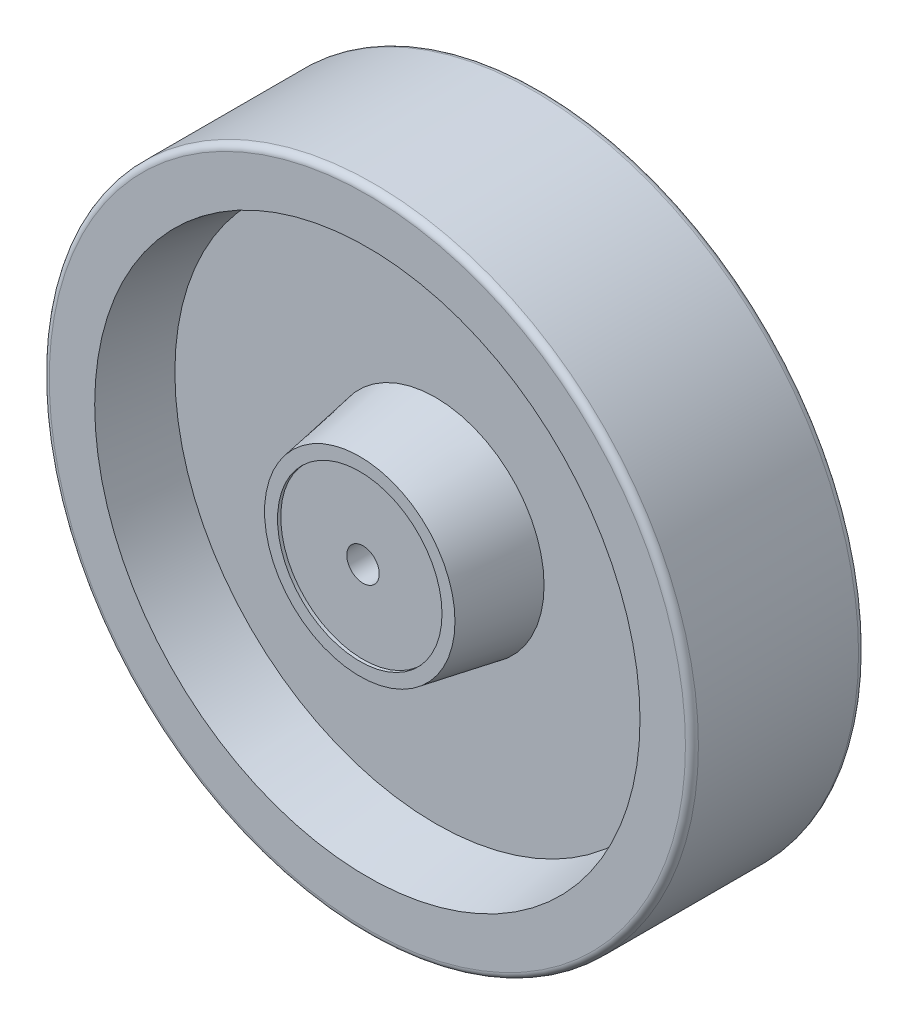
ISO-10303-21;
HEADER;
FILE_DESCRIPTION(('STEP AP214'),'2;1');
FILE_NAME('part.step','',(''),(''),'','','');
FILE_SCHEMA(('AUTOMOTIVE_DESIGN { 1 0 10303 214 1 1 1 1 }'));
ENDSEC;
DATA;
#1=APPLICATION_CONTEXT('core data for automotive mechanical design processes');
#2=APPLICATION_PROTOCOL_DEFINITION('international standard','automotive_design',2000,#1);
#3=PRODUCT_CONTEXT('',#1,'mechanical');
#4=PRODUCT('Part','Part','',(#3));
#5=PRODUCT_RELATED_PRODUCT_CATEGORY('part','',(#4));
#6=PRODUCT_DEFINITION_FORMATION('','',#4);
#7=PRODUCT_DEFINITION_CONTEXT('part definition',#1,'design');
#8=PRODUCT_DEFINITION('design','',#6,#7);
#9=PRODUCT_DEFINITION_SHAPE('','',#8);
#10=(LENGTH_UNIT() NAMED_UNIT(*) SI_UNIT(.MILLI.,.METRE.));
#11=(NAMED_UNIT(*) PLANE_ANGLE_UNIT() SI_UNIT($,.RADIAN.));
#12=(NAMED_UNIT(*) SI_UNIT($,.STERADIAN.) SOLID_ANGLE_UNIT());
#13=UNCERTAINTY_MEASURE_WITH_UNIT(LENGTH_MEASURE(1.E-05),#10,'distance_accuracy_value','');
#14=(GEOMETRIC_REPRESENTATION_CONTEXT(3) GLOBAL_UNCERTAINTY_ASSIGNED_CONTEXT((#13)) GLOBAL_UNIT_ASSIGNED_CONTEXT((#10,
#11,#12)) REPRESENTATION_CONTEXT('',''));
#15=CARTESIAN_POINT('',(0.,0.,0.));
#16=DIRECTION('',(0.,0.,1.));
#17=DIRECTION('',(1.,0.,0.));
#18=AXIS2_PLACEMENT_3D('',#15,#16,#17);
#19=CARTESIAN_POINT('',(-60.9792009608828,0.,-23.405263798385));
#20=DIRECTION('',(0.46915522596175,0.,0.88311571945741));
#21=DIRECTION('',(-0.88311571945741,0.,0.46915522596175));
#22=AXIS2_PLACEMENT_3D('',#19,#20,#21);
#23=CONICAL_SURFACE('',#22,6.73089108484627,0.5235987755983);
#24=CARTESIAN_POINT('',(-60.9792009608828,0.,-23.405263798385));
#25=DIRECTION('',(-0.46915522596175,0.,-0.88311571945741));
#26=DIRECTION('',(-0.88311571945741,0.,0.46915522596175));
#27=AXIS2_PLACEMENT_3D('',#24,#25,#26);
#28=CIRCLE('',#27,6.73089108484627);
#29=CARTESIAN_POINT('',(-64.2959109708729,5.58566717395844,-21.6432616055778));
#30=VERTEX_POINT('',#29);
#31=CARTESIAN_POINT('',(-58.365634094339,6.04535764736213,-24.7937211962364));
#32=VERTEX_POINT('',#31);
#33=EDGE_CURVE('E158',#30,#32,#28,.T.);
#34=ORIENTED_EDGE('',*,*,#33,.T.);
#35=CARTESIAN_POINT('',(-55.0489240843489,0.459690473403682,-26.5557233890436));
#36=VERTEX_POINT('',#35);
#37=EDGE_CURVE('E45',#32,#36,#28,.T.);
#38=ORIENTED_EDGE('',*,*,#37,.T.);
#39=CARTESIAN_POINT('',(-57.6624909508927,-5.58566717395845,-25.1672659911923));
#40=VERTEX_POINT('',#39);
#41=EDGE_CURVE('E364',#36,#40,#28,.T.);
#42=ORIENTED_EDGE('',*,*,#41,.T.);
#43=CARTESIAN_POINT('',(-63.5927678274265,-6.04535764736211,-22.0168064005337));
#44=VERTEX_POINT('',#43);
#45=EDGE_CURVE('E61',#40,#44,#28,.T.);
#46=ORIENTED_EDGE('',*,*,#45,.T.);
#47=CARTESIAN_POINT('',(-66.9094778374166,-0.459690473403658,-20.2548042077264));
#48=VERTEX_POINT('',#47);
#49=EDGE_CURVE('E53',#44,#48,#28,.T.);
#50=ORIENTED_EDGE('',*,*,#49,.T.);
#51=EDGE_CURVE('E138',#48,#30,#28,.T.);
#52=ORIENTED_EDGE('',*,*,#51,.T.);
#53=EDGE_LOOP('',(#34,#38,#42,#46,#50,#52));
#54=FACE_BOUND('',#53,.T.);
#55=CARTESIAN_POINT('',(-64.4883220555265,-4.4205081740278,-24.8627700240867));
#56=CARTESIAN_POINT('',(-64.7087002204241,-4.28497331583104,-24.743166119385));
#57=CARTESIAN_POINT('',(-64.9190908751772,-4.12794948236647,-24.6289846445134));
#58=CARTESIAN_POINT('',(-65.3136077691302,-3.7754516879385,-24.4148786839049));
#59=CARTESIAN_POINT('',(-65.4977009692173,-3.57993008034467,-24.3149721325971));
#60=CARTESIAN_POINT('',(-65.832367815397,-3.15835143896003,-24.1333520249623));
#61=CARTESIAN_POINT('',(-65.9832650082415,-2.93262713723524,-24.0514628599575));
#62=CARTESIAN_POINT('',(-66.2495616776063,-2.45562601857691,-23.9069497496824));
#63=CARTESIAN_POINT('',(-66.3649713734922,-2.20435658568359,-23.8443202581866));
#64=CARTESIAN_POINT('',(-66.5570907047619,-1.68331534130899,-23.7400632727159));
#65=CARTESIAN_POINT('',(-66.6337966403682,-1.41354176377478,-23.6984377865601));
#66=CARTESIAN_POINT('',(-66.7463148115719,-0.863159150658155,-23.6373784840726));
#67=CARTESIAN_POINT('',(-66.7821251410125,-0.582549610638303,-23.6179457021497));
#68=CARTESIAN_POINT('',(-66.8118285471942,-0.0184845170048821,-23.6018268865248));
#69=CARTESIAN_POINT('',(-66.8057233024284,0.264970922191859,-23.6051399419743));
#70=CARTESIAN_POINT('',(-66.751772860393,0.826691493665252,-23.6344166524389));
#71=CARTESIAN_POINT('',(-66.703927787699,1.10495664143018,-23.6603802398517));
#72=CARTESIAN_POINT('',(-66.5678565473826,1.64839808164374,-23.7342210887059));
#73=CARTESIAN_POINT('',(-66.4796304265124,1.91357438924594,-23.7820983247761));
#74=CARTESIAN_POINT('',(-66.2653024317951,2.42331070204704,-23.898407747574));
#75=CARTESIAN_POINT('',(-66.139200626979,2.66787074481944,-23.9668398968391));
#76=CARTESIAN_POINT('',(-65.8526997479187,3.12943625905417,-24.1223182994771));
#77=CARTESIAN_POINT('',(-65.6923002314557,3.34644137517851,-24.2093647928548));
#78=CARTESIAN_POINT('',(-65.3417587276492,3.74673407081167,-24.3996013183485));
#79=CARTESIAN_POINT('',(-65.1516167024515,3.93002160740643,-24.5027913710109));
#80=CARTESIAN_POINT('',(-64.7469837827709,4.25768038195765,-24.7223891713248));
#81=CARTESIAN_POINT('',(-64.5324923291811,4.402050726048,-24.8387972224856));
#82=CARTESIAN_POINT('',(-64.0852534483816,4.64777189489679,-25.0815254440194));
#83=CARTESIAN_POINT('',(-63.8525060268649,4.74912273307013,-25.2078456113014));
#84=CARTESIAN_POINT('',(-63.37535643469,4.90593039892822,-25.4668162255069));
#85=CARTESIAN_POINT('',(-63.1309539812252,4.96138611237858,-25.5994668260369));
#86=CARTESIAN_POINT('',(-62.6374374647081,5.02482545660266,-25.8673304080813));
#87=CARTESIAN_POINT('',(-62.3883234004903,5.03280907563419,-26.0025433902295));
#88=CARTESIAN_POINT('',(-61.8924515474719,5.00107739803382,-26.271695559154));
#89=CARTESIAN_POINT('',(-61.6456937926485,4.96136141463466,-26.4056347275624));
#90=CARTESIAN_POINT('',(-61.1615428171209,4.83535663676138,-26.6684348812727));
#91=CARTESIAN_POINT('',(-60.9241495961111,4.74906784380723,-26.7972958667402));
#92=CARTESIAN_POINT('',(-60.4654668136334,4.53236680075836,-27.0462808068521));
#93=CARTESIAN_POINT('',(-60.2441772245002,4.40195462646825,-27.1664047765063));
#94=CARTESIAN_POINT('',(-59.8239829398101,4.10070842712321,-27.3945049514336));
#95=CARTESIAN_POINT('',(-59.6250782436374,3.9298744031805,-27.5024811570409));
#96=CARTESIAN_POINT('',(-59.2553033506573,3.55263701342234,-27.7032176319435));
#97=CARTESIAN_POINT('',(-59.0844326676065,3.34623426466567,-27.7959781651511));
#98=CARTESIAN_POINT('',(-58.7755722188353,2.9037163816557,-27.9636510071072));
#99=CARTESIAN_POINT('',(-58.6375824442325,2.66760125542895,-28.0385633206773));
#100=CARTESIAN_POINT('',(-58.3984041518741,2.17236770512245,-28.1684102100615));
#101=CARTESIAN_POINT('',(-58.2972146884809,1.91324987234363,-28.2233452992195));
#102=CARTESIAN_POINT('',(-58.1345045690065,1.37936128903987,-28.3116799784501));
#103=CARTESIAN_POINT('',(-58.0729839240532,1.104590534124,-28.3450795624815));
#104=CARTESIAN_POINT('',(-57.9913588773492,0.547202650314479,-28.3893939047104));
#105=CARTESIAN_POINT('',(-57.9712535624521,0.264585694557161,-28.400309158654));
#106=CARTESIAN_POINT('',(-57.973027185617,-0.300477275556065,-28.3993462533321));
#107=CARTESIAN_POINT('',(-57.9949060749779,-0.582923290109882,-28.3874681205068));
#108=CARTESIAN_POINT('',(-58.0800265094023,-1.1396240919758,-28.3412561406732));
#109=CARTESIAN_POINT('',(-58.1432676610524,-1.41387895717134,-28.3069225072485));
#110=CARTESIAN_POINT('',(-58.3093171844871,-1.94641564766139,-28.2167749282155));
#111=CARTESIAN_POINT('',(-58.4121256301351,-2.20469744313664,-28.1609609425081));
#112=CARTESIAN_POINT('',(-58.6543921551022,-2.69795751448418,-28.0294375957046));
#113=CARTESIAN_POINT('',(-58.7938504648963,-2.932935643797,-27.9537281094943));
#114=CARTESIAN_POINT('',(-59.105458191418,-3.37291722147118,-27.7845640108249));
#115=CARTESIAN_POINT('',(-59.2776076802198,-3.57792060374541,-27.6911093592429));
#116=CARTESIAN_POINT('',(-59.6497187019929,-3.95214120811364,-27.4891049369794));
#117=CARTESIAN_POINT('',(-59.8496813781754,-4.12135695850016,-27.3805545458145));
#118=CARTESIAN_POINT('',(-60.2717292991088,-4.41918227513954,-27.1514484506762));
#119=CARTESIAN_POINT('',(-60.4938136503915,-4.54779348048778,-27.0308932315637));
#120=CARTESIAN_POINT('',(-60.9537870394079,-4.76076126550653,-26.7812080905727));
#121=CARTESIAN_POINT('',(-61.19167477768,-4.845121478732,-26.6520788737069));
#122=CARTESIAN_POINT('',(-61.6765910430847,-4.96722143849908,-26.3888637278131));
#123=CARTESIAN_POINT('',(-61.9236218971166,-5.00494923200893,-26.2547765370022));
#124=CARTESIAN_POINT('',(-62.4198491460965,-5.03269502662599,-25.9854318933545));
#125=CARTESIAN_POINT('',(-62.6690465808655,-5.02268869470783,-25.8501738787502));
#126=CARTESIAN_POINT('',(-63.1622083134243,-4.95518245508352,-25.5825032930822));
#127=CARTESIAN_POINT('',(-63.4061787123048,-4.89774140503732,-25.4500874042698));
#128=CARTESIAN_POINT('',(-63.7903000473873,-4.76815963384436,-25.2416077343927));
#129=CARTESIAN_POINT('',(-63.9342632191698,-4.710189501839,-25.1634734278291));
#130=CARTESIAN_POINT('',(-64.2161600930446,-4.57763988179795,-25.0104788347238));
#131=CARTESIAN_POINT('',(-64.3540936624915,-4.50306002858396,-24.935618620209));
#132=CARTESIAN_POINT('',(-64.4883220555265,-4.4205081740278,-24.8627700240867));
#133=B_SPLINE_CURVE_WITH_KNOTS('',3,(#55,#56,#57,#58,#59,#60,#61,#62,#63,#64,#65,#66,#67,#68,
#69,#70,#71,#72,#73,#74,#75,#76,#77,#78,#79,#80,#81,#82,#83,#84,#85,#86,#87,#88,#89,#90,#91,#92,
#93,#94,#95,#96,#97,#98,#99,#100,#101,#102,#103,#104,#105,#106,#107,#108,#109,#110,#111,#112,
#113,#114,#115,#116,#117,#118,#119,#120,#121,#122,#123,#124,#125,#126,#127,#128,#129,#130,#131,
#132),.UNSPECIFIED.,.T.,.F.,(4,2,2,2,2,2,2,2,2,2,2,2,2,2,2,2,2,2,2,2,2,2,2,2,2,2,2,2,2,2,2,2,2,
2,2,2,2,2,4),(0.,0.854439671611864,1.7099435609238,2.55669830217031,3.4032089738562,
4.24980055003578,5.09643158450298,5.94302871615343,6.78962332108032,7.63621694584176,
8.48280902763869,9.3294120256606,10.1760161011889,11.0226396202119,11.8692628752298,
12.715906683827,13.5625507018409,14.4092069097755,15.2558630900782,16.1025178158208,
16.9491725182679,17.7958125341292,18.6424523212782,19.4890703512476,20.3356886187097,
21.1822882192965,22.0288868378372,22.875477404149,23.7220695508678,24.568667021566,
25.4152663587812,26.2619005042349,27.1085004689928,27.9550309065134,28.8017782855585,
29.6489573500352,30.4950867996116,31.0154992568563,31.5359231569242),.UNSPECIFIED.);
#134=CARTESIAN_POINT('',(-64.4883220555265,-4.4205081740278,-24.8627700240867));
#135=VERTEX_POINT('',#134);
#136=EDGE_CURVE('E11',#135,#135,#133,.T.);
#137=ORIENTED_EDGE('',*,*,#136,.F.);
#138=EDGE_LOOP('',(#137));
#139=FACE_BOUND('',#138,.T.);
#140=ADVANCED_FACE('F36',(#54,#139),#23,.T.);
#141=CARTESIAN_POINT('',(-23.1191565757933,0.,-43.5184123779638));
#142=DIRECTION('',(-0.46915522596175,0.,-0.88311571945741));
#143=DIRECTION('',(-0.883115719457411,0.,0.46915522596175));
#144=AXIS2_PLACEMENT_3D('',#141,#142,#143);
#145=PLANE('',#144);
#146=ORIENTED_EDGE('',*,*,#33,.F.);
#147=DIRECTION('',(0.732858461502294,0.557978317621429,-0.389331057673094));
#148=VECTOR('',#147,1.);
#149=CARTESIAN_POINT('',(-67.143858885232,3.41731780036985,-20.1302892760744));
#150=LINE('',#149,#148);
#151=CARTESIAN_POINT('',(-61.4479630565137,7.75401654754704,-23.1562339350811));
#152=VERTEX_POINT('',#151);
#153=EDGE_CURVE('E145',#30,#152,#150,.T.);
#154=ORIENTED_EDGE('',*,*,#153,.T.);
#155=DIRECTION('',(0.793171409376547,-0.439686809758063,-0.42137231123129));
#156=VECTOR('',#155,1.);
#157=CARTESIAN_POINT('',(-61.4479630565137,7.75401654754704,-23.1562339350811));
#158=LINE('',#157,#156);
#159=EDGE_CURVE('E160',#152,#32,#158,.T.);
#160=ORIENTED_EDGE('',*,*,#159,.T.);
#161=EDGE_LOOP('',(#146,#154,#160));
#162=FACE_BOUND('',#161,.T.);
#163=ADVANCED_FACE('F159',(#162),#145,.T.);
#164=ORIENTED_EDGE('',*,*,#37,.F.);
#165=CARTESIAN_POINT('',(-55.2833051321644,4.3366987471772,-26.4312084573917));
#166=VERTEX_POINT('',#165);
#167=EDGE_CURVE('E144',#32,#166,#158,.T.);
#168=ORIENTED_EDGE('',*,*,#167,.T.);
#169=DIRECTION('',(0.0603129478742525,-0.997665127379492,-0.0320412535581968));
#170=VECTOR('',#169,1.);
#171=CARTESIAN_POINT('',(-55.2833051321644,4.3366987471772,-26.4312084573917));
#172=LINE('',#171,#170);
#173=EDGE_CURVE('E178',#166,#36,#172,.T.);
#174=ORIENTED_EDGE('',*,*,#173,.T.);
#175=EDGE_LOOP('',(#164,#168,#174));
#176=FACE_BOUND('',#175,.T.);
#177=ADVANCED_FACE('F322',(#176),#145,.T.);
#178=ORIENTED_EDGE('',*,*,#41,.F.);
#179=CARTESIAN_POINT('',(-54.8145430365334,-3.41731780036985,-26.6802383206956));
#180=VERTEX_POINT('',#179);
#181=EDGE_CURVE('E177',#36,#180,#172,.T.);
#182=ORIENTED_EDGE('',*,*,#181,.T.);
#183=DIRECTION('',(-0.732858461502294,-0.557978317621429,0.389331057673094));
#184=VECTOR('',#183,1.);
#185=CARTESIAN_POINT('',(-54.8145430365334,-3.41731780036985,-26.6802383206956));
#186=LINE('',#185,#184);
#187=EDGE_CURVE('E182',#180,#40,#186,.T.);
#188=ORIENTED_EDGE('',*,*,#187,.T.);
#189=EDGE_LOOP('',(#178,#182,#188));
#190=FACE_BOUND('',#189,.T.);
#191=ADVANCED_FACE('F366',(#190),#145,.T.);
#192=ORIENTED_EDGE('',*,*,#45,.F.);
#193=CARTESIAN_POINT('',(-60.5104388652518,-7.75401654754704,-23.6542936616889));
#194=VERTEX_POINT('',#193);
#195=EDGE_CURVE('E181',#40,#194,#186,.T.);
#196=ORIENTED_EDGE('',*,*,#195,.T.);
#197=DIRECTION('',(-0.793171409376547,0.439686809758062,0.42137231123129));
#198=VECTOR('',#197,1.);
#199=CARTESIAN_POINT('',(-60.5104388652518,-7.75401654754704,-23.6542936616889));
#200=LINE('',#199,#198);
#201=EDGE_CURVE('E186',#194,#44,#200,.T.);
#202=ORIENTED_EDGE('',*,*,#201,.T.);
#203=EDGE_LOOP('',(#192,#196,#202));
#204=FACE_BOUND('',#203,.T.);
#205=ADVANCED_FACE('F368',(#204),#145,.T.);
#206=ORIENTED_EDGE('',*,*,#49,.F.);
#207=CARTESIAN_POINT('',(-66.6750967896012,-4.33669874717719,-20.3793191393784));
#208=VERTEX_POINT('',#207);
#209=EDGE_CURVE('E185',#44,#208,#200,.T.);
#210=ORIENTED_EDGE('',*,*,#209,.T.);
#211=DIRECTION('',(-0.0603129478742508,0.997665127379492,0.0320412535581964));
#212=VECTOR('',#211,1.);
#213=CARTESIAN_POINT('',(-66.6750967896012,-4.33669874717719,-20.3793191393784));
#214=LINE('',#213,#212);
#215=EDGE_CURVE('E156',#208,#48,#214,.T.);
#216=ORIENTED_EDGE('',*,*,#215,.T.);
#217=EDGE_LOOP('',(#206,#210,#216));
#218=FACE_BOUND('',#217,.T.);
#219=ADVANCED_FACE('F274',(#218),#145,.T.);
#220=CARTESIAN_POINT('',(-71.6659104489058,12.5,-11.5));
#221=DIRECTION('',(0.469155225961749,0.,0.883115719457411));
#222=DIRECTION('',(0.883115719457411,0.,-0.469155225961749));
#223=AXIS2_PLACEMENT_3D('',#220,#221,#222);
#224=PLANE('',#223);
#225=DIRECTION('',(-0.883115719457411,0.,0.469155225961749));
#226=VECTOR('',#225,1.);
#227=CARTESIAN_POINT('',(-71.6659104489058,12.5,-11.5));
#228=LINE('',#227,#226);
#229=CARTESIAN_POINT('',(-45.5064352609483,12.5,-25.3972211936024));
#230=VERTEX_POINT('',#229);
#231=CARTESIAN_POINT('',(-71.6659104489058,12.5,-11.5));
#232=VERTEX_POINT('',#231);
#233=EDGE_CURVE('E220',#230,#232,#228,.T.);
#234=ORIENTED_EDGE('',*,*,#233,.F.);
#235=CARTESIAN_POINT('',(-4.05694091494414,0.,-47.4172650649171));
#236=DIRECTION('',(0.469155225961749,0.,0.883115719457411));
#237=DIRECTION('',(-0.883115719457411,0.,0.469155225961749));
#238=AXIS2_PLACEMENT_3D('',#235,#236,#237);
#239=ELLIPSE('',#238,49.0414557506436,43.1188474564812);
#240=CARTESIAN_POINT('',(-45.5064352609483,-12.5,-25.3972211936024));
#241=VERTEX_POINT('',#240);
#242=EDGE_CURVE('E166',#230,#241,#239,.T.);
#243=ORIENTED_EDGE('',*,*,#242,.T.);
#244=DIRECTION('',(-0.883115719457411,0.,0.469155225961749));
#245=VECTOR('',#244,1.);
#246=CARTESIAN_POINT('',(-71.6659104489058,-12.5,-11.5));
#247=LINE('',#246,#245);
#248=CARTESIAN_POINT('',(-71.6659104489058,-12.5,-11.5));
#249=VERTEX_POINT('',#248);
#250=EDGE_CURVE('E219',#241,#249,#247,.T.);
#251=ORIENTED_EDGE('',*,*,#250,.T.);
#252=DIRECTION('',(0.,-1.,0.));
#253=VECTOR('',#252,1.);
#254=CARTESIAN_POINT('',(-71.6659104489058,12.5,-11.5));
#255=LINE('',#254,#253);
#256=EDGE_CURVE('E235',#232,#249,#255,.T.);
#257=ORIENTED_EDGE('',*,*,#256,.F.);
#258=EDGE_LOOP('',(#234,#243,#251,#257));
#259=FACE_BOUND('',#258,.T.);
#260=DIRECTION('',(-0.0603129478742508,0.997665127379492,0.0320412535581964));
#261=VECTOR('',#260,1.);
#262=CARTESIAN_POINT('',(-64.0947430468115,-4.33669874717719,-15.5221826823626));
#263=LINE('',#262,#261);
#264=CARTESIAN_POINT('',(-64.0947430468115,-4.33669874717719,-15.5221826823626));
#265=VERTEX_POINT('',#264);
#266=CARTESIAN_POINT('',(-64.5635051424424,3.41731780036985,-15.2731528190587));
#267=VERTEX_POINT('',#266);
#268=EDGE_CURVE('E163',#265,#267,#263,.T.);
#269=ORIENTED_EDGE('',*,*,#268,.F.);
#270=DIRECTION('',(-0.793171409376547,0.439686809758062,0.42137231123129));
#271=VECTOR('',#270,1.);
#272=CARTESIAN_POINT('',(-57.9300851224622,-7.75401654754704,-18.7971572046732));
#273=LINE('',#272,#271);
#274=CARTESIAN_POINT('',(-57.9300851224622,-7.75401654754704,-18.7971572046732));
#275=VERTEX_POINT('',#274);
#276=EDGE_CURVE('E202',#275,#265,#273,.T.);
#277=ORIENTED_EDGE('',*,*,#276,.F.);
#278=DIRECTION('',(-0.732858461502294,-0.557978317621429,0.389331057673094));
#279=VECTOR('',#278,1.);
#280=CARTESIAN_POINT('',(-52.2341892937438,-3.41731780036985,-21.8231018636798));
#281=LINE('',#280,#279);
#282=CARTESIAN_POINT('',(-52.2341892937438,-3.41731780036985,-21.8231018636798));
#283=VERTEX_POINT('',#282);
#284=EDGE_CURVE('E199',#283,#275,#281,.T.);
#285=ORIENTED_EDGE('',*,*,#284,.F.);
#286=DIRECTION('',(0.0603129478742525,-0.997665127379492,-0.0320412535581968));
#287=VECTOR('',#286,1.);
#288=CARTESIAN_POINT('',(-52.7029513893747,4.3366987471772,-21.5740720003759));
#289=LINE('',#288,#287);
#290=CARTESIAN_POINT('',(-52.7029513893747,4.3366987471772,-21.5740720003759));
#291=VERTEX_POINT('',#290);
#292=EDGE_CURVE('E196',#291,#283,#289,.T.);
#293=ORIENTED_EDGE('',*,*,#292,.F.);
#294=DIRECTION('',(0.793171409376547,-0.439686809758063,-0.42137231123129));
#295=VECTOR('',#294,1.);
#296=CARTESIAN_POINT('',(-58.867609313724,7.75401654754704,-18.2990974780653));
#297=LINE('',#296,#295);
#298=CARTESIAN_POINT('',(-58.867609313724,7.75401654754704,-18.2990974780653));
#299=VERTEX_POINT('',#298);
#300=EDGE_CURVE('E193',#299,#291,#297,.T.);
#301=ORIENTED_EDGE('',*,*,#300,.F.);
#302=DIRECTION('',(0.732858461502294,0.557978317621429,-0.389331057673094));
#303=VECTOR('',#302,1.);
#304=CARTESIAN_POINT('',(-64.5635051424424,3.41731780036985,-15.2731528190587));
#305=LINE('',#304,#303);
#306=EDGE_CURVE('E191',#267,#299,#305,.T.);
#307=ORIENTED_EDGE('',*,*,#306,.F.);
#308=EDGE_LOOP('',(#269,#277,#285,#293,#301,#307));
#309=FACE_BOUND('',#308,.T.);
#310=ADVANCED_FACE('F271',(#259,#309),#224,.F.);
#311=CARTESIAN_POINT('',(0.,0.,-43.5));
#312=DIRECTION('',(0.,0.,1.));
#313=DIRECTION('',(1.,0.,0.));
#314=AXIS2_PLACEMENT_3D('',#311,#312,#313);
#315=CONICAL_SURFACE('',#314,44.,0.17453292519943);
#316=CARTESIAN_POINT('',(0.,0.,-43.5));
#317=DIRECTION('',(0.,0.,1.));
#318=DIRECTION('',(1.,0.,0.));
#319=AXIS2_PLACEMENT_3D('',#316,#317,#318);
#320=CIRCLE('',#319,44.);
#321=CARTESIAN_POINT('',(44.,0.,-43.5));
#322=VERTEX_POINT('',#321);
#323=EDGE_CURVE('E552',#322,#322,#320,.T.);
#324=ORIENTED_EDGE('',*,*,#323,.T.);
#325=EDGE_LOOP('',(#324));
#326=FACE_BOUND('',#325,.T.);
#327=CARTESIAN_POINT('',(-52.9719108416584,12.5,15.6331535132528));
#328=CARTESIAN_POINT('',(-51.9409663412414,12.5,9.94283698727564));
#329=CARTESIAN_POINT('',(-50.9085429714736,12.5,4.25278794046723));
#330=CARTESIAN_POINT('',(-48.8400010765503,12.5,-7.12663459923445));
#331=CARTESIAN_POINT('',(-47.8038825537648,12.5,-12.8160080925586));
#332=CARTESIAN_POINT('',(-45.7272113851078,12.5,-24.1939474919918));
#333=CARTESIAN_POINT('',(-44.6866587382511,12.5,-29.8825133979212));
#334=CARTESIAN_POINT('',(-43.1217285882645,12.5,-38.4146118683563));
#335=CARTESIAN_POINT('',(-42.5994015049499,12.5,-41.2585205491395));
#336=CARTESIAN_POINT('',(-41.5532147540601,12.5,-46.9460561731461));
#337=CARTESIAN_POINT('',(-41.0293550863872,12.5,-49.7896831163515));
#338=CARTESIAN_POINT('',(-40.5046463420939,12.5,-52.6331535132529));
#339=B_SPLINE_CURVE_WITH_KNOTS('',3,(#327,#328,#329,#330,#331,#332,#333,#334,#335,#336,#337,
#338),.UNSPECIFIED.,.F.,.F.,(4,2,2,2,2,4),(0.,17.3488603081812,34.6977094914786,
52.0465625298561,60.7209946746128,69.395427371579),.UNSPECIFIED.);
#340=CARTESIAN_POINT('',(-48.5893386005214,12.5,-8.50000000000001));
#341=VERTEX_POINT('',#340);
#342=EDGE_CURVE('E247',#341,#230,#339,.T.);
#343=ORIENTED_EDGE('',*,*,#342,.F.);
#344=CARTESIAN_POINT('',(0.,0.,-8.5));
#345=DIRECTION('',(0.,0.,1.));
#346=DIRECTION('',(1.,0.,0.));
#347=AXIS2_PLACEMENT_3D('',#344,#345,#346);
#348=CIRCLE('',#347,50.1714443247962);
#349=CARTESIAN_POINT('',(-48.5893386005214,-12.5,-8.5));
#350=VERTEX_POINT('',#349);
#351=EDGE_CURVE('E581',#350,#341,#348,.T.);
#352=ORIENTED_EDGE('',*,*,#351,.F.);
#353=CARTESIAN_POINT('',(-52.9719108416584,-12.5,15.6331535132528));
#354=CARTESIAN_POINT('',(-51.9409663412414,-12.5,9.94283698727564));
#355=CARTESIAN_POINT('',(-50.9085429714736,-12.5,4.25278794046723));
#356=CARTESIAN_POINT('',(-48.8400010765503,-12.5,-7.12663459923445));
#357=CARTESIAN_POINT('',(-47.8038825537648,-12.5,-12.8160080925586));
#358=CARTESIAN_POINT('',(-45.7272113851078,-12.5,-24.1939474919918));
#359=CARTESIAN_POINT('',(-44.6866587382511,-12.5,-29.8825133979212));
#360=CARTESIAN_POINT('',(-43.1217285882645,-12.5,-38.4146118683563));
#361=CARTESIAN_POINT('',(-42.5994015049499,-12.5,-41.2585205491395));
#362=CARTESIAN_POINT('',(-41.5532147540601,-12.5,-46.9460561731461));
#363=CARTESIAN_POINT('',(-41.0293550863872,-12.5,-49.7896831163515));
#364=CARTESIAN_POINT('',(-40.5046463420939,-12.5,-52.6331535132529));
#365=B_SPLINE_CURVE_WITH_KNOTS('',3,(#353,#354,#355,#356,#357,#358,#359,#360,#361,#362,#363,
#364),.UNSPECIFIED.,.F.,.F.,(4,2,2,2,2,4),(0.,17.3488603081812,34.6977094914786,
52.0465625298561,60.7209946746128,69.395427371579),.UNSPECIFIED.);
#366=EDGE_CURVE('E238',#350,#241,#365,.T.);
#367=ORIENTED_EDGE('',*,*,#366,.T.);
#368=ORIENTED_EDGE('',*,*,#242,.F.);
#369=EDGE_LOOP('',(#343,#352,#367,#368));
#370=FACE_BOUND('',#369,.T.);
#371=ADVANCED_FACE('F254',(#326,#370),#315,.T.);
#372=CARTESIAN_POINT('',(-50.1714443247962,0.,-8.5));
#373=DIRECTION('',(0.,0.,1.));
#374=DIRECTION('',(1.,0.,0.));
#375=AXIS2_PLACEMENT_3D('',#372,#373,#374);
#376=PLANE('',#375);
#377=CARTESIAN_POINT('',(0.,0.,-8.50000000000001));
#378=DIRECTION('',(0.,0.,1.));
#379=DIRECTION('',(1.,0.,0.));
#380=AXIS2_PLACEMENT_3D('',#377,#378,#379);
#381=CIRCLE('',#380,120.445700107683);
#382=CARTESIAN_POINT('',(120.445700107683,0.,-8.50000000000001));
#383=VERTEX_POINT('',#382);
#384=EDGE_CURVE('E572',#383,#383,#381,.T.);
#385=ORIENTED_EDGE('',*,*,#384,.F.);
#386=EDGE_LOOP('',(#385));
#387=FACE_BOUND('',#386,.T.);
#388=DIRECTION('',(1.,0.,0.));
#389=VECTOR('',#388,1.);
#390=CARTESIAN_POINT('',(-36.6659104489058,12.5,-8.50000000000001));
#391=LINE('',#390,#389);
#392=CARTESIAN_POINT('',(-71.6659104489058,12.5,-8.50000000000001));
#393=VERTEX_POINT('',#392);
#394=EDGE_CURVE('E225',#393,#341,#391,.T.);
#395=ORIENTED_EDGE('',*,*,#394,.F.);
#396=DIRECTION('',(0.,-1.,0.));
#397=VECTOR('',#396,1.);
#398=CARTESIAN_POINT('',(-71.6659104489058,12.5,-8.50000000000001));
#399=LINE('',#398,#397);
#400=CARTESIAN_POINT('',(-71.6659104489058,-12.5,-8.50000000000001));
#401=VERTEX_POINT('',#400);
#402=EDGE_CURVE('E227',#393,#401,#399,.T.);
#403=ORIENTED_EDGE('',*,*,#402,.T.);
#404=DIRECTION('',(1.,0.,0.));
#405=VECTOR('',#404,1.);
#406=CARTESIAN_POINT('',(-36.6659104489058,-12.5,-8.50000000000001));
#407=LINE('',#406,#405);
#408=EDGE_CURVE('E223',#401,#350,#407,.T.);
#409=ORIENTED_EDGE('',*,*,#408,.T.);
#410=ORIENTED_EDGE('',*,*,#351,.T.);
#411=EDGE_LOOP('',(#395,#403,#409,#410));
#412=FACE_BOUND('',#411,.T.);
#413=ADVANCED_FACE('F302',(#387,#412),#376,.F.);
#414=CARTESIAN_POINT('',(0.,0.,40.));
#415=DIRECTION('',(0.,0.,1.));
#416=DIRECTION('',(1.,0.,0.));
#417=AXIS2_PLACEMENT_3D('',#414,#415,#416);
#418=PLANE('',#417);
#419=CARTESIAN_POINT('',(0.,0.,40.));
#420=DIRECTION('',(0.,0.,1.));
#421=DIRECTION('',(1.,0.,0.));
#422=AXIS2_PLACEMENT_3D('',#419,#420,#421);
#423=CIRCLE('',#422,147.);
#424=CARTESIAN_POINT('',(147.,0.,40.));
#425=VERTEX_POINT('',#424);
#426=EDGE_CURVE('E167',#425,#425,#423,.T.);
#427=ORIENTED_EDGE('',*,*,#426,.T.);
#428=EDGE_LOOP('',(#427));
#429=FACE_BOUND('',#428,.T.);
#430=CARTESIAN_POINT('',(0.,0.,40.));
#431=DIRECTION('',(0.,0.,1.));
#432=DIRECTION('',(1.,0.,0.));
#433=AXIS2_PLACEMENT_3D('',#430,#431,#432);
#434=CIRCLE('',#433,126.);
#435=CARTESIAN_POINT('',(126.,0.,40.));
#436=VERTEX_POINT('',#435);
#437=EDGE_CURVE('E566',#436,#436,#434,.T.);
#438=ORIENTED_EDGE('',*,*,#437,.F.);
#439=EDGE_LOOP('',(#438));
#440=FACE_BOUND('',#439,.T.);
#441=ADVANCED_FACE('F304',(#429,#440),#418,.T.);
#442=CARTESIAN_POINT('',(0.,0.,-40.));
#443=DIRECTION('',(0.,0.,1.));
#444=DIRECTION('',(1.,0.,0.));
#445=AXIS2_PLACEMENT_3D('',#442,#443,#444);
#446=PLANE('',#445);
#447=CARTESIAN_POINT('',(0.,0.,-40.));
#448=DIRECTION('',(0.,0.,1.));
#449=DIRECTION('',(1.,0.,0.));
#450=AXIS2_PLACEMENT_3D('',#447,#448,#449);
#451=CIRCLE('',#450,147.);
#452=CARTESIAN_POINT('',(147.,0.,-40.));
#453=VERTEX_POINT('',#452);
#454=EDGE_CURVE('E557',#453,#453,#451,.F.);
#455=ORIENTED_EDGE('',*,*,#454,.T.);
#456=EDGE_LOOP('',(#455));
#457=FACE_BOUND('',#456,.T.);
#458=CARTESIAN_POINT('',(0.,0.,-40.));
#459=DIRECTION('',(0.,0.,1.));
#460=DIRECTION('',(1.,0.,0.));
#461=AXIS2_PLACEMENT_3D('',#458,#459,#460);
#462=CIRCLE('',#461,126.);
#463=CARTESIAN_POINT('',(126.,0.,-40.));
#464=VERTEX_POINT('',#463);
#465=EDGE_CURVE('E568',#464,#464,#462,.T.);
#466=ORIENTED_EDGE('',*,*,#465,.T.);
#467=EDGE_LOOP('',(#466));
#468=FACE_BOUND('',#467,.T.);
#469=ADVANCED_FACE('F310',(#457,#468),#446,.F.);
#470=CARTESIAN_POINT('',(0.,0.,40.));
#471=DIRECTION('',(0.,0.,-1.));
#472=DIRECTION('',(-1.,0.,0.));
#473=AXIS2_PLACEMENT_3D('',#470,#471,#472);
#474=CYLINDRICAL_SURFACE('',#473,150.);
#475=CARTESIAN_POINT('',(0.,0.,-37.));
#476=DIRECTION('',(0.,0.,1.));
#477=DIRECTION('',(1.,0.,0.));
#478=AXIS2_PLACEMENT_3D('',#475,#476,#477);
#479=CIRCLE('',#478,150.);
#480=CARTESIAN_POINT('',(150.,0.,-37.));
#481=VERTEX_POINT('',#480);
#482=EDGE_CURVE('E549',#481,#481,#479,.T.);
#483=ORIENTED_EDGE('',*,*,#482,.T.);
#484=EDGE_LOOP('',(#483));
#485=FACE_BOUND('',#484,.T.);
#486=CARTESIAN_POINT('',(0.,0.,37.));
#487=DIRECTION('',(0.,0.,1.));
#488=DIRECTION('',(1.,0.,0.));
#489=AXIS2_PLACEMENT_3D('',#486,#487,#488);
#490=CIRCLE('',#489,150.);
#491=CARTESIAN_POINT('',(150.,0.,37.));
#492=VERTEX_POINT('',#491);
#493=EDGE_CURVE('E545',#492,#492,#490,.F.);
#494=ORIENTED_EDGE('',*,*,#493,.T.);
#495=EDGE_LOOP('',(#494));
#496=FACE_BOUND('',#495,.T.);
#497=ADVANCED_FACE('F475',(#485,#496),#474,.T.);
#498=CARTESIAN_POINT('',(0.,0.,-37.));
#499=DIRECTION('',(0.,0.,1.));
#500=DIRECTION('',(1.,0.,0.));
#501=AXIS2_PLACEMENT_3D('',#498,#499,#500);
#502=TOROIDAL_SURFACE('',#501,147.,3.);
#503=ORIENTED_EDGE('',*,*,#454,.F.);
#504=EDGE_LOOP('',(#503));
#505=FACE_BOUND('',#504,.T.);
#506=ORIENTED_EDGE('',*,*,#482,.F.);
#507=EDGE_LOOP('',(#506));
#508=FACE_BOUND('',#507,.T.);
#509=ADVANCED_FACE('F502',(#505,#508),#502,.T.);
#510=CARTESIAN_POINT('',(0.,0.,37.));
#511=DIRECTION('',(0.,0.,1.));
#512=DIRECTION('',(1.,0.,0.));
#513=AXIS2_PLACEMENT_3D('',#510,#511,#512);
#514=TOROIDAL_SURFACE('',#513,147.,3.);
#515=ORIENTED_EDGE('',*,*,#493,.F.);
#516=EDGE_LOOP('',(#515));
#517=FACE_BOUND('',#516,.T.);
#518=ORIENTED_EDGE('',*,*,#426,.F.);
#519=EDGE_LOOP('',(#518));
#520=FACE_BOUND('',#519,.T.);
#521=ADVANCED_FACE('F38',(#517,#520),#514,.T.);
#522=CARTESIAN_POINT('',(0.,0.,42.));
#523=DIRECTION('',(0.,0.,-1.));
#524=DIRECTION('',(-1.,0.,0.));
#525=AXIS2_PLACEMENT_3D('',#522,#523,#524);
#526=PLANE('',#525);
#527=CARTESIAN_POINT('',(0.,0.,42.));
#528=DIRECTION('',(0.,0.,-1.));
#529=DIRECTION('',(-1.,0.,0.));
#530=AXIS2_PLACEMENT_3D('',#527,#528,#529);
#531=CIRCLE('',#530,7.5);
#532=CARTESIAN_POINT('',(-7.5,0.,42.));
#533=VERTEX_POINT('',#532);
#534=EDGE_CURVE('E40',#533,#533,#531,.T.);
#535=ORIENTED_EDGE('',*,*,#534,.T.);
#536=EDGE_LOOP('',(#535));
#537=FACE_BOUND('',#536,.T.);
#538=CARTESIAN_POINT('',(0.,0.,42.));
#539=DIRECTION('',(0.,0.,1.));
#540=DIRECTION('',(1.,0.,0.));
#541=AXIS2_PLACEMENT_3D('',#538,#539,#540);
#542=CIRCLE('',#541,38.);
#543=CARTESIAN_POINT('',(38.,0.,42.));
#544=VERTEX_POINT('',#543);
#545=EDGE_CURVE('E592',#544,#544,#542,.T.);
#546=ORIENTED_EDGE('',*,*,#545,.T.);
#547=EDGE_LOOP('',(#546));
#548=FACE_BOUND('',#547,.T.);
#549=ADVANCED_FACE('F280',(#537,#548),#526,.F.);
#550=CARTESIAN_POINT('',(0.,0.,0.));
#551=DIRECTION('',(0.,0.,1.));
#552=DIRECTION('',(1.,0.,0.));
#553=AXIS2_PLACEMENT_3D('',#550,#551,#552);
#554=CYLINDRICAL_SURFACE('',#553,38.);
#555=ORIENTED_EDGE('',*,*,#545,.F.);
#556=EDGE_LOOP('',(#555));
#557=FACE_BOUND('',#556,.T.);
#558=CARTESIAN_POINT('',(0.,0.,43.5));
#559=DIRECTION('',(0.,0.,1.));
#560=DIRECTION('',(1.,0.,0.));
#561=AXIS2_PLACEMENT_3D('',#558,#559,#560);
#562=CIRCLE('',#561,38.);
#563=CARTESIAN_POINT('',(38.,0.,43.5));
#564=VERTEX_POINT('',#563);
#565=EDGE_CURVE('E601',#564,#564,#562,.T.);
#566=ORIENTED_EDGE('',*,*,#565,.T.);
#567=EDGE_LOOP('',(#566));
#568=FACE_BOUND('',#567,.T.);
#569=ADVANCED_FACE('F276',(#557,#568),#554,.F.);
#570=CARTESIAN_POINT('',(-38.,0.,43.5));
#571=DIRECTION('',(0.,0.,-1.));
#572=DIRECTION('',(-1.,0.,0.));
#573=AXIS2_PLACEMENT_3D('',#570,#571,#572);
#574=PLANE('',#573);
#575=ORIENTED_EDGE('',*,*,#565,.F.);
#576=EDGE_LOOP('',(#575));
#577=FACE_BOUND('',#576,.T.);
#578=CARTESIAN_POINT('',(0.,0.,43.5));
#579=DIRECTION('',(0.,0.,1.));
#580=DIRECTION('',(1.,0.,0.));
#581=AXIS2_PLACEMENT_3D('',#578,#579,#580);
#582=CIRCLE('',#581,44.);
#583=CARTESIAN_POINT('',(44.,0.,43.5));
#584=VERTEX_POINT('',#583);
#585=EDGE_CURVE('E605',#584,#584,#582,.T.);
#586=ORIENTED_EDGE('',*,*,#585,.T.);
#587=EDGE_LOOP('',(#586));
#588=FACE_BOUND('',#587,.T.);
#589=ADVANCED_FACE('F279',(#577,#588),#574,.F.);
#590=CARTESIAN_POINT('',(0.,0.,8.5));
#591=DIRECTION('',(0.,0.,-1.));
#592=DIRECTION('',(-1.,0.,0.));
#593=AXIS2_PLACEMENT_3D('',#590,#591,#592);
#594=CONICAL_SURFACE('',#593,50.1714443247962,0.17453292519943);
#595=ORIENTED_EDGE('',*,*,#585,.F.);
#596=EDGE_LOOP('',(#595));
#597=FACE_BOUND('',#596,.T.);
#598=CARTESIAN_POINT('',(0.,0.,8.5));
#599=DIRECTION('',(0.,0.,1.));
#600=DIRECTION('',(1.,0.,0.));
#601=AXIS2_PLACEMENT_3D('',#598,#599,#600);
#602=CIRCLE('',#601,50.1714443247962);
#603=CARTESIAN_POINT('',(50.1714443247962,0.,8.5));
#604=VERTEX_POINT('',#603);
#605=EDGE_CURVE('E575',#604,#604,#602,.T.);
#606=ORIENTED_EDGE('',*,*,#605,.T.);
#607=EDGE_LOOP('',(#606));
#608=FACE_BOUND('',#607,.T.);
#609=ADVANCED_FACE('F284',(#597,#608),#594,.T.);
#610=CARTESIAN_POINT('',(-50.1714443247962,0.,8.5));
#611=DIRECTION('',(0.,0.,-1.));
#612=DIRECTION('',(-1.,0.,0.));
#613=AXIS2_PLACEMENT_3D('',#610,#611,#612);
#614=PLANE('',#613);
#615=ORIENTED_EDGE('',*,*,#605,.F.);
#616=EDGE_LOOP('',(#615));
#617=FACE_BOUND('',#616,.T.);
#618=CARTESIAN_POINT('',(0.,0.,8.50000000000001));
#619=DIRECTION('',(0.,0.,1.));
#620=DIRECTION('',(1.,0.,0.));
#621=AXIS2_PLACEMENT_3D('',#618,#619,#620);
#622=CIRCLE('',#621,120.445700107683);
#623=CARTESIAN_POINT('',(120.445700107683,0.,8.50000000000001));
#624=VERTEX_POINT('',#623);
#625=EDGE_CURVE('E569',#624,#624,#622,.T.);
#626=ORIENTED_EDGE('',*,*,#625,.T.);
#627=EDGE_LOOP('',(#626));
#628=FACE_BOUND('',#627,.T.);
#629=ADVANCED_FACE('F288',(#617,#628),#614,.F.);
#630=CARTESIAN_POINT('',(0.,0.,40.));
#631=DIRECTION('',(0.,0.,1.));
#632=DIRECTION('',(1.,0.,0.));
#633=AXIS2_PLACEMENT_3D('',#630,#631,#632);
#634=CONICAL_SURFACE('',#633,126.,0.174532925199429);
#635=ORIENTED_EDGE('',*,*,#625,.F.);
#636=EDGE_LOOP('',(#635));
#637=FACE_BOUND('',#636,.T.);
#638=ORIENTED_EDGE('',*,*,#437,.T.);
#639=EDGE_LOOP('',(#638));
#640=FACE_BOUND('',#639,.T.);
#641=ADVANCED_FACE('F292',(#637,#640),#634,.F.);
#642=CARTESIAN_POINT('',(0.,0.,-42.));
#643=DIRECTION('',(0.,0.,1.));
#644=DIRECTION('',(1.,0.,0.));
#645=AXIS2_PLACEMENT_3D('',#642,#643,#644);
#646=PLANE('',#645);
#647=CARTESIAN_POINT('',(0.,0.,-42.));
#648=DIRECTION('',(0.,0.,-1.));
#649=DIRECTION('',(-1.,0.,0.));
#650=AXIS2_PLACEMENT_3D('',#647,#648,#649);
#651=CIRCLE('',#650,7.5);
#652=CARTESIAN_POINT('',(-7.5,0.,-42.));
#653=VERTEX_POINT('',#652);
#654=EDGE_CURVE('E540',#653,#653,#651,.T.);
#655=ORIENTED_EDGE('',*,*,#654,.F.);
#656=EDGE_LOOP('',(#655));
#657=FACE_BOUND('',#656,.T.);
#658=CARTESIAN_POINT('',(0.,0.,-42.));
#659=DIRECTION('',(0.,0.,1.));
#660=DIRECTION('',(1.,0.,0.));
#661=AXIS2_PLACEMENT_3D('',#658,#659,#660);
#662=CIRCLE('',#661,38.);
#663=CARTESIAN_POINT('',(38.,0.,-42.));
#664=VERTEX_POINT('',#663);
#665=EDGE_CURVE('E543',#664,#664,#662,.T.);
#666=ORIENTED_EDGE('',*,*,#665,.F.);
#667=EDGE_LOOP('',(#666));
#668=FACE_BOUND('',#667,.T.);
#669=ADVANCED_FACE('F296',(#657,#668),#646,.F.);
#670=CARTESIAN_POINT('',(0.,0.,0.));
#671=DIRECTION('',(0.,0.,1.));
#672=DIRECTION('',(1.,0.,0.));
#673=AXIS2_PLACEMENT_3D('',#670,#671,#672);
#674=CYLINDRICAL_SURFACE('',#673,38.);
#675=CARTESIAN_POINT('',(0.,0.,-43.5));
#676=DIRECTION('',(0.,0.,1.));
#677=DIRECTION('',(1.,0.,0.));
#678=AXIS2_PLACEMENT_3D('',#675,#676,#677);
#679=CIRCLE('',#678,38.);
#680=CARTESIAN_POINT('',(38.,0.,-43.5));
#681=VERTEX_POINT('',#680);
#682=EDGE_CURVE('E546',#681,#681,#679,.T.);
#683=ORIENTED_EDGE('',*,*,#682,.F.);
#684=EDGE_LOOP('',(#683));
#685=FACE_BOUND('',#684,.T.);
#686=ORIENTED_EDGE('',*,*,#665,.T.);
#687=EDGE_LOOP('',(#686));
#688=FACE_BOUND('',#687,.T.);
#689=ADVANCED_FACE('F424',(#685,#688),#674,.F.);
#690=CARTESIAN_POINT('',(-38.,0.,-43.5));
#691=DIRECTION('',(0.,0.,1.));
#692=DIRECTION('',(1.,0.,0.));
#693=AXIS2_PLACEMENT_3D('',#690,#691,#692);
#694=PLANE('',#693);
#695=ORIENTED_EDGE('',*,*,#323,.F.);
#696=EDGE_LOOP('',(#695));
#697=FACE_BOUND('',#696,.T.);
#698=ORIENTED_EDGE('',*,*,#682,.T.);
#699=EDGE_LOOP('',(#698));
#700=FACE_BOUND('',#699,.T.);
#701=ADVANCED_FACE('F300',(#697,#700),#694,.F.);
#702=CARTESIAN_POINT('',(0.,0.,-8.50000000000001));
#703=DIRECTION('',(0.,0.,-1.));
#704=DIRECTION('',(-1.,0.,0.));
#705=AXIS2_PLACEMENT_3D('',#702,#703,#704);
#706=CONICAL_SURFACE('',#705,120.445700107683,0.174532925199429);
#707=ORIENTED_EDGE('',*,*,#465,.F.);
#708=EDGE_LOOP('',(#707));
#709=FACE_BOUND('',#708,.T.);
#710=ORIENTED_EDGE('',*,*,#384,.T.);
#711=EDGE_LOOP('',(#710));
#712=FACE_BOUND('',#711,.T.);
#713=ADVANCED_FACE('F298',(#709,#712),#706,.F.);
#714=CARTESIAN_POINT('',(0.,12.5,0.));
#715=DIRECTION('',(0.,-1.,0.));
#716=DIRECTION('',(0.,0.,-1.));
#717=AXIS2_PLACEMENT_3D('',#714,#715,#716);
#718=PLANE('',#717);
#719=ORIENTED_EDGE('',*,*,#394,.T.);
#720=ORIENTED_EDGE('',*,*,#342,.T.);
#721=ORIENTED_EDGE('',*,*,#233,.T.);
#722=DIRECTION('',(0.,0.,1.));
#723=VECTOR('',#722,1.);
#724=CARTESIAN_POINT('',(-71.6659104489058,12.5,-8.50000000000001));
#725=LINE('',#724,#723);
#726=EDGE_CURVE('E222',#232,#393,#725,.T.);
#727=ORIENTED_EDGE('',*,*,#726,.T.);
#728=EDGE_LOOP('',(#719,#720,#721,#727));
#729=FACE_BOUND('',#728,.T.);
#730=ADVANCED_FACE('F263',(#729),#718,.F.);
#731=CARTESIAN_POINT('',(0.,-12.5,0.));
#732=DIRECTION('',(0.,-1.,0.));
#733=DIRECTION('',(0.,0.,-1.));
#734=AXIS2_PLACEMENT_3D('',#731,#732,#733);
#735=PLANE('',#734);
#736=ORIENTED_EDGE('',*,*,#366,.F.);
#737=ORIENTED_EDGE('',*,*,#408,.F.);
#738=DIRECTION('',(0.,0.,1.));
#739=VECTOR('',#738,1.);
#740=CARTESIAN_POINT('',(-71.6659104489058,-12.5,-8.50000000000001));
#741=LINE('',#740,#739);
#742=EDGE_CURVE('E229',#249,#401,#741,.T.);
#743=ORIENTED_EDGE('',*,*,#742,.F.);
#744=ORIENTED_EDGE('',*,*,#250,.F.);
#745=EDGE_LOOP('',(#736,#737,#743,#744));
#746=FACE_BOUND('',#745,.T.);
#747=ADVANCED_FACE('F258',(#746),#735,.T.);
#748=CARTESIAN_POINT('',(-71.6659104489058,12.5,-8.50000000000001));
#749=DIRECTION('',(1.,0.,0.));
#750=DIRECTION('',(0.,0.,-1.));
#751=AXIS2_PLACEMENT_3D('',#748,#749,#750);
#752=PLANE('',#751);
#753=ORIENTED_EDGE('',*,*,#742,.T.);
#754=ORIENTED_EDGE('',*,*,#402,.F.);
#755=ORIENTED_EDGE('',*,*,#726,.F.);
#756=ORIENTED_EDGE('',*,*,#256,.T.);
#757=EDGE_LOOP('',(#753,#754,#755,#756));
#758=FACE_BOUND('',#757,.T.);
#759=ADVANCED_FACE('F262',(#758),#752,.F.);
#760=CARTESIAN_POINT('',(-66.6750967896012,-4.33669874717719,-20.3793191393784));
#761=DIRECTION('',(0.881053756743309,0.0682956339077597,-0.468059808269883));
#762=DIRECTION('',(-0.469155225961749,0.,-0.883115719457411));
#763=AXIS2_PLACEMENT_3D('',#760,#761,#762);
#764=PLANE('',#763);
#765=ORIENTED_EDGE('',*,*,#268,.T.);
#766=DIRECTION('',(0.469155225961749,0.,0.883115719457411));
#767=VECTOR('',#766,1.);
#768=CARTESIAN_POINT('',(-67.143858885232,3.41731780036985,-20.1302892760744));
#769=LINE('',#768,#767);
#770=CARTESIAN_POINT('',(-67.143858885232,3.41731780036985,-20.1302892760744));
#771=VERTEX_POINT('',#770);
#772=EDGE_CURVE('E217',#771,#267,#769,.T.);
#773=ORIENTED_EDGE('',*,*,#772,.F.);
#774=EDGE_CURVE('E140',#48,#771,#214,.T.);
#775=ORIENTED_EDGE('',*,*,#774,.F.);
#776=ORIENTED_EDGE('',*,*,#215,.F.);
#777=DIRECTION('',(0.469155225961749,0.,0.883115719457411));
#778=VECTOR('',#777,1.);
#779=CARTESIAN_POINT('',(-66.6750967896012,-4.33669874717719,-20.3793191393784));
#780=LINE('',#779,#778);
#781=EDGE_CURVE('E188',#208,#265,#780,.T.);
#782=ORIENTED_EDGE('',*,*,#781,.T.);
#783=EDGE_LOOP('',(#765,#773,#775,#776,#782));
#784=FACE_BOUND('',#783,.T.);
#785=ADVANCED_FACE('F269',(#784),#764,.F.);
#786=CARTESIAN_POINT('',(-67.143858885232,3.41731780036985,-20.1302892760744));
#787=DIRECTION('',(0.492759423407884,-0.829855527826597,-0.261778443685438));
#788=DIRECTION('',(0.859839868146373,0.510563807125053,0.));
#789=AXIS2_PLACEMENT_3D('',#786,#787,#788);
#790=PLANE('',#789);
#791=ORIENTED_EDGE('',*,*,#306,.T.);
#792=DIRECTION('',(0.469155225961749,0.,0.883115719457411));
#793=VECTOR('',#792,1.);
#794=CARTESIAN_POINT('',(-61.4479630565137,7.75401654754704,-23.1562339350811));
#795=LINE('',#794,#793);
#796=EDGE_CURVE('E152',#152,#299,#795,.T.);
#797=ORIENTED_EDGE('',*,*,#796,.F.);
#798=ORIENTED_EDGE('',*,*,#153,.F.);
#799=EDGE_CURVE('E134',#771,#30,#150,.T.);
#800=ORIENTED_EDGE('',*,*,#799,.F.);
#801=ORIENTED_EDGE('',*,*,#772,.T.);
#802=EDGE_LOOP('',(#791,#797,#798,#800,#801));
#803=FACE_BOUND('',#802,.T.);
#804=ADVANCED_FACE('F150',(#803),#790,.F.);
#805=CARTESIAN_POINT('',(-61.4479630565137,7.75401654754704,-23.1562339350811));
#806=DIRECTION('',(-0.388294333335425,-0.898151161734358,0.206281364584445));
#807=DIRECTION('',(0.917892535603041,-0.396829047682021,0.));
#808=AXIS2_PLACEMENT_3D('',#805,#806,#807);
#809=PLANE('',#808);
#810=ORIENTED_EDGE('',*,*,#300,.T.);
#811=DIRECTION('',(0.469155225961749,0.,0.883115719457411));
#812=VECTOR('',#811,1.);
#813=CARTESIAN_POINT('',(-55.2833051321644,4.3366987471772,-26.4312084573917));
#814=LINE('',#813,#812);
#815=EDGE_CURVE('E213',#166,#291,#814,.T.);
#816=ORIENTED_EDGE('',*,*,#815,.F.);
#817=ORIENTED_EDGE('',*,*,#167,.F.);
#818=ORIENTED_EDGE('',*,*,#159,.F.);
#819=ORIENTED_EDGE('',*,*,#796,.T.);
#820=EDGE_LOOP('',(#810,#816,#817,#818,#819));
#821=FACE_BOUND('',#820,.T.);
#822=ADVANCED_FACE('F341',(#821),#809,.F.);
#823=CARTESIAN_POINT('',(-55.2833051321644,4.3366987471772,-26.4312084573917));
#824=DIRECTION('',(-0.881053756743309,-0.0682956339077613,0.468059808269883));
#825=DIRECTION('',(0.469155225961749,0.,0.883115719457411));
#826=AXIS2_PLACEMENT_3D('',#823,#824,#825);
#827=PLANE('',#826);
#828=ORIENTED_EDGE('',*,*,#292,.T.);
#829=DIRECTION('',(0.469155225961749,0.,0.883115719457411));
#830=VECTOR('',#829,1.);
#831=CARTESIAN_POINT('',(-54.8145430365334,-3.41731780036985,-26.6802383206956));
#832=LINE('',#831,#830);
#833=EDGE_CURVE('E210',#180,#283,#832,.T.);
#834=ORIENTED_EDGE('',*,*,#833,.F.);
#835=ORIENTED_EDGE('',*,*,#181,.F.);
#836=ORIENTED_EDGE('',*,*,#173,.F.);
#837=ORIENTED_EDGE('',*,*,#815,.T.);
#838=EDGE_LOOP('',(#828,#834,#835,#836,#837));
#839=FACE_BOUND('',#838,.T.);
#840=ADVANCED_FACE('F337',(#839),#827,.F.);
#841=CARTESIAN_POINT('',(-54.8145430365334,-3.41731780036985,-26.6802383206956));
#842=DIRECTION('',(-0.492759423407884,0.829855527826597,0.261778443685438));
#843=DIRECTION('',(-0.859839868146373,-0.510563807125053,0.));
#844=AXIS2_PLACEMENT_3D('',#841,#842,#843);
#845=PLANE('',#844);
#846=ORIENTED_EDGE('',*,*,#284,.T.);
#847=DIRECTION('',(0.469155225961749,0.,0.883115719457411));
#848=VECTOR('',#847,1.);
#849=CARTESIAN_POINT('',(-60.5104388652518,-7.75401654754704,-23.6542936616889));
#850=LINE('',#849,#848);
#851=EDGE_CURVE('E207',#194,#275,#850,.T.);
#852=ORIENTED_EDGE('',*,*,#851,.F.);
#853=ORIENTED_EDGE('',*,*,#195,.F.);
#854=ORIENTED_EDGE('',*,*,#187,.F.);
#855=ORIENTED_EDGE('',*,*,#833,.T.);
#856=EDGE_LOOP('',(#846,#852,#853,#854,#855));
#857=FACE_BOUND('',#856,.T.);
#858=ADVANCED_FACE('F333',(#857),#845,.F.);
#859=CARTESIAN_POINT('',(-60.5104388652518,-7.75401654754704,-23.6542936616889));
#860=DIRECTION('',(0.388294333335425,0.898151161734358,-0.206281364584444));
#861=DIRECTION('',(-0.917892535603042,0.39682904768202,0.));
#862=AXIS2_PLACEMENT_3D('',#859,#860,#861);
#863=PLANE('',#862);
#864=ORIENTED_EDGE('',*,*,#276,.T.);
#865=ORIENTED_EDGE('',*,*,#781,.F.);
#866=ORIENTED_EDGE('',*,*,#209,.F.);
#867=ORIENTED_EDGE('',*,*,#201,.F.);
#868=ORIENTED_EDGE('',*,*,#851,.T.);
#869=EDGE_LOOP('',(#864,#865,#866,#867,#868));
#870=FACE_BOUND('',#869,.T.);
#871=ADVANCED_FACE('F330',(#870),#863,.F.);
#872=ORIENTED_EDGE('',*,*,#51,.F.);
#873=ORIENTED_EDGE('',*,*,#774,.T.);
#874=ORIENTED_EDGE('',*,*,#799,.T.);
#875=EDGE_LOOP('',(#872,#873,#874));
#876=FACE_BOUND('',#875,.T.);
#877=ADVANCED_FACE('F136',(#876),#145,.T.);
#878=CARTESIAN_POINT('',(-63.7165243174955,0.,-28.4494349863285));
#879=DIRECTION('',(0.485475514296405,0.,0.87425026452306));
#880=DIRECTION('',(0.87425026452306,0.,-0.485475514296405));
#881=AXIS2_PLACEMENT_3D('',#878,#879,#880);
#882=SPHERICAL_SURFACE('',#881,5.74462616855527);
#883=ORIENTED_EDGE('',*,*,#136,.T.);
#884=EDGE_LOOP('',(#883));
#885=FACE_BOUND('',#884,.T.);
#886=ADVANCED_FACE('F325',(#885),#882,.T.);
#887=CARTESIAN_POINT('',(0.,0.,43.5));
#888=DIRECTION('',(0.,0.,-1.));
#889=DIRECTION('',(-1.,0.,0.));
#890=AXIS2_PLACEMENT_3D('',#887,#888,#889);
#891=CYLINDRICAL_SURFACE('',#890,7.5);
#892=ORIENTED_EDGE('',*,*,#654,.T.);
#893=EDGE_LOOP('',(#892));
#894=FACE_BOUND('',#893,.T.);
#895=ORIENTED_EDGE('',*,*,#534,.F.);
#896=EDGE_LOOP('',(#895));
#897=FACE_BOUND('',#896,.T.);
#898=ADVANCED_FACE('F629',(#894,#897),#891,.F.);
#899=CLOSED_SHELL('',(#140,#163,#177,#191,#205,#219,#310,#371,#413,#441,#469,#497,#509,#521,
#549,#569,#589,#609,#629,#641,#669,#689,#701,#713,#730,#747,#759,#785,#804,#822,#840,#858,#871,
#877,#886,#898));
#900=MANIFOLD_SOLID_BREP('B2',#899);
#901=ADVANCED_BREP_SHAPE_REPRESENTATION('',(#18,#900),#14);
#902=SHAPE_DEFINITION_REPRESENTATION(#9,#901);
ENDSEC;
END-ISO-10303-21;
